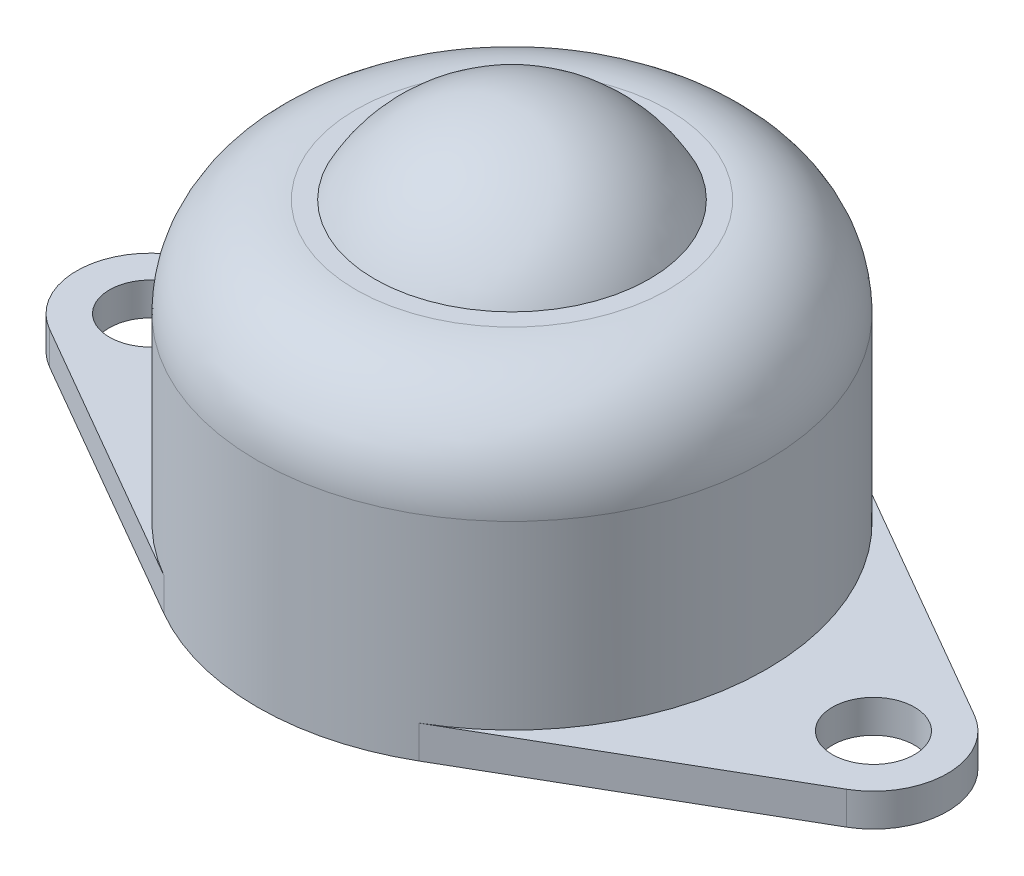
ISO-10303-21;
HEADER;
FILE_DESCRIPTION(('STEP AP214'),'2;1');
FILE_NAME('part.step','',(''),(''),'','','');
FILE_SCHEMA(('AUTOMOTIVE_DESIGN { 1 0 10303 214 1 1 1 1 }'));
ENDSEC;
DATA;
#1=APPLICATION_CONTEXT('core data for automotive mechanical design processes');
#2=APPLICATION_PROTOCOL_DEFINITION('international standard','automotive_design',2000,#1);
#3=PRODUCT_CONTEXT('',#1,'mechanical');
#4=PRODUCT('Part','Part','',(#3));
#5=PRODUCT_RELATED_PRODUCT_CATEGORY('part','',(#4));
#6=PRODUCT_DEFINITION_FORMATION('','',#4);
#7=PRODUCT_DEFINITION_CONTEXT('part definition',#1,'design');
#8=PRODUCT_DEFINITION('design','',#6,#7);
#9=PRODUCT_DEFINITION_SHAPE('','',#8);
#10=(LENGTH_UNIT() NAMED_UNIT(*) SI_UNIT(.MILLI.,.METRE.));
#11=(NAMED_UNIT(*) PLANE_ANGLE_UNIT() SI_UNIT($,.RADIAN.));
#12=(NAMED_UNIT(*) SI_UNIT($,.STERADIAN.) SOLID_ANGLE_UNIT());
#13=UNCERTAINTY_MEASURE_WITH_UNIT(LENGTH_MEASURE(1.E-05),#10,'distance_accuracy_value','');
#14=(GEOMETRIC_REPRESENTATION_CONTEXT(3) GLOBAL_UNCERTAINTY_ASSIGNED_CONTEXT((#13)) GLOBAL_UNIT_ASSIGNED_CONTEXT((#10,
#11,#12)) REPRESENTATION_CONTEXT('',''));
#15=CARTESIAN_POINT('',(0.,0.,0.));
#16=DIRECTION('',(0.,0.,1.));
#17=DIRECTION('',(1.,0.,0.));
#18=AXIS2_PLACEMENT_3D('',#15,#16,#17);
#19=CARTESIAN_POINT('',(0.,-1.5,0.));
#20=DIRECTION('',(0.,1.,0.));
#21=DIRECTION('',(0.,0.,1.));
#22=AXIS2_PLACEMENT_3D('',#19,#20,#21);
#23=TOROIDAL_SURFACE('',#22,9.5,6.);
#24=CARTESIAN_POINT('',(0.,4.5,0.));
#25=DIRECTION('',(0.,1.,0.));
#26=DIRECTION('',(0.,0.,1.));
#27=AXIS2_PLACEMENT_3D('',#24,#25,#26);
#28=CIRCLE('',#27,9.49999999999996);
#29=CARTESIAN_POINT('',(0.,4.5,9.49999999999996));
#30=VERTEX_POINT('',#29);
#31=EDGE_CURVE('E175',#30,#30,#28,.T.);
#32=ORIENTED_EDGE('',*,*,#31,.F.);
#33=EDGE_LOOP('',(#32));
#34=FACE_BOUND('',#33,.T.);
#35=CARTESIAN_POINT('',(0.,-1.50000000000004,0.));
#36=DIRECTION('',(0.,1.,0.));
#37=DIRECTION('',(0.,0.,1.));
#38=AXIS2_PLACEMENT_3D('',#35,#36,#37);
#39=CIRCLE('',#38,15.5);
#40=CARTESIAN_POINT('',(0.,-1.50000000000004,15.5));
#41=VERTEX_POINT('',#40);
#42=EDGE_CURVE('E155',#41,#41,#39,.T.);
#43=ORIENTED_EDGE('',*,*,#42,.T.);
#44=EDGE_LOOP('',(#43));
#45=FACE_BOUND('',#44,.T.);
#46=ADVANCED_FACE('F38',(#34,#45),#23,.T.);
#47=CARTESIAN_POINT('',(9.49999999999996,4.5,0.));
#48=DIRECTION('',(0.,-1.,0.));
#49=DIRECTION('',(0.,0.,-1.));
#50=AXIS2_PLACEMENT_3D('',#47,#48,#49);
#51=PLANE('',#50);
#52=CARTESIAN_POINT('',(0.,4.5,0.));
#53=DIRECTION('',(0.,1.,0.));
#54=DIRECTION('',(0.,0.,1.));
#55=AXIS2_PLACEMENT_3D('',#52,#53,#54);
#56=CIRCLE('',#55,8.36660026534075);
#57=CARTESIAN_POINT('',(0.,4.5,8.36660026534075));
#58=VERTEX_POINT('',#57);
#59=EDGE_CURVE('E172',#58,#58,#56,.T.);
#60=ORIENTED_EDGE('',*,*,#59,.F.);
#61=EDGE_LOOP('',(#60));
#62=FACE_BOUND('',#61,.T.);
#63=ORIENTED_EDGE('',*,*,#31,.T.);
#64=EDGE_LOOP('',(#63));
#65=FACE_BOUND('',#64,.T.);
#66=ADVANCED_FACE('F215',(#62,#65),#51,.F.);
#67=CARTESIAN_POINT('',(0.,0.,0.));
#68=DIRECTION('',(0.,1.,0.));
#69=DIRECTION('',(1.,0.,0.));
#70=AXIS2_PLACEMENT_3D('',#67,#68,#69);
#71=SPHERICAL_SURFACE('',#70,9.5);
#72=ORIENTED_EDGE('',*,*,#59,.T.);
#73=EDGE_LOOP('',(#72));
#74=FACE_BOUND('',#73,.T.);
#75=ADVANCED_FACE('F220',(#74),#71,.T.);
#76=CARTESIAN_POINT('',(0.,-14.5,0.));
#77=DIRECTION('',(0.,1.,0.));
#78=DIRECTION('',(0.,0.,1.));
#79=AXIS2_PLACEMENT_3D('',#76,#77,#78);
#80=PLANE('',#79);
#81=CARTESIAN_POINT('',(0.,-14.5,0.));
#82=DIRECTION('',(0.,1.,0.));
#83=DIRECTION('',(0.,0.,1.));
#84=AXIS2_PLACEMENT_3D('',#81,#82,#83);
#85=CIRCLE('',#84,15.5);
#86=CARTESIAN_POINT('',(7.75,-14.5,-13.4233937586588));
#87=VERTEX_POINT('',#86);
#88=CARTESIAN_POINT('',(-7.75,-14.5,-13.4233937586588));
#89=VERTEX_POINT('',#88);
#90=EDGE_CURVE('E171',#87,#89,#85,.T.);
#91=ORIENTED_EDGE('',*,*,#90,.F.);
#92=DIRECTION('',(0.866025403784439,0.,0.5));
#93=VECTOR('',#92,1.);
#94=CARTESIAN_POINT('',(24.25,-14.5,-3.89711431702997));
#95=LINE('',#94,#93);
#96=CARTESIAN_POINT('',(24.25,-14.5,-3.89711431702997));
#97=VERTEX_POINT('',#96);
#98=EDGE_CURVE('E124',#87,#97,#95,.T.);
#99=ORIENTED_EDGE('',*,*,#98,.T.);
#100=CARTESIAN_POINT('',(22.,-14.5,0.));
#101=DIRECTION('',(0.,-1.,0.));
#102=DIRECTION('',(0.,0.,1.));
#103=AXIS2_PLACEMENT_3D('',#100,#101,#102);
#104=CIRCLE('',#103,4.5);
#105=CARTESIAN_POINT('',(24.25,-14.5,3.89711431702997));
#106=VERTEX_POINT('',#105);
#107=EDGE_CURVE('E142',#97,#106,#104,.T.);
#108=ORIENTED_EDGE('',*,*,#107,.T.);
#109=DIRECTION('',(-0.866025403784439,0.,0.5));
#110=VECTOR('',#109,1.);
#111=CARTESIAN_POINT('',(24.25,-14.5,3.89711431702997));
#112=LINE('',#111,#110);
#113=CARTESIAN_POINT('',(7.75,-14.5,13.4233937586588));
#114=VERTEX_POINT('',#113);
#115=EDGE_CURVE('E106',#106,#114,#112,.T.);
#116=ORIENTED_EDGE('',*,*,#115,.T.);
#117=CARTESIAN_POINT('',(-7.75,-14.5,13.4233937586588));
#118=VERTEX_POINT('',#117);
#119=EDGE_CURVE('E169',#118,#114,#85,.T.);
#120=ORIENTED_EDGE('',*,*,#119,.F.);
#121=DIRECTION('',(-0.866025403784439,0.,-0.5));
#122=VECTOR('',#121,1.);
#123=CARTESIAN_POINT('',(-24.25,-14.5,3.89711431702997));
#124=LINE('',#123,#122);
#125=CARTESIAN_POINT('',(-24.25,-14.5,3.89711431702997));
#126=VERTEX_POINT('',#125);
#127=EDGE_CURVE('E146',#118,#126,#124,.T.);
#128=ORIENTED_EDGE('',*,*,#127,.T.);
#129=CARTESIAN_POINT('',(-22.,-14.5,0.));
#130=DIRECTION('',(0.,-1.,0.));
#131=DIRECTION('',(0.,0.,-1.));
#132=AXIS2_PLACEMENT_3D('',#129,#130,#131);
#133=CIRCLE('',#132,4.5);
#134=CARTESIAN_POINT('',(-24.25,-14.5,-3.89711431702997));
#135=VERTEX_POINT('',#134);
#136=EDGE_CURVE('E149',#126,#135,#133,.T.);
#137=ORIENTED_EDGE('',*,*,#136,.T.);
#138=DIRECTION('',(0.866025403784439,0.,-0.5));
#139=VECTOR('',#138,1.);
#140=CARTESIAN_POINT('',(-24.25,-14.5,-3.89711431702997));
#141=LINE('',#140,#139);
#142=EDGE_CURVE('E127',#135,#89,#141,.T.);
#143=ORIENTED_EDGE('',*,*,#142,.T.);
#144=EDGE_LOOP('',(#91,#99,#108,#116,#120,#128,#137,#143));
#145=FACE_BOUND('',#144,.T.);
#146=CARTESIAN_POINT('',(-22.,-14.5,0.));
#147=DIRECTION('',(0.,-1.,0.));
#148=DIRECTION('',(0.,0.,-1.));
#149=AXIS2_PLACEMENT_3D('',#146,#147,#148);
#150=CIRCLE('',#149,2.5);
#151=CARTESIAN_POINT('',(-22.,-14.5,-2.5));
#152=VERTEX_POINT('',#151);
#153=EDGE_CURVE('E130',#152,#152,#150,.T.);
#154=ORIENTED_EDGE('',*,*,#153,.F.);
#155=EDGE_LOOP('',(#154));
#156=FACE_BOUND('',#155,.T.);
#157=CARTESIAN_POINT('',(22.,-14.5,0.));
#158=DIRECTION('',(0.,-1.,0.));
#159=DIRECTION('',(0.,0.,1.));
#160=AXIS2_PLACEMENT_3D('',#157,#158,#159);
#161=CIRCLE('',#160,2.5);
#162=CARTESIAN_POINT('',(22.,-14.5,2.5));
#163=VERTEX_POINT('',#162);
#164=EDGE_CURVE('E333',#163,#163,#161,.T.);
#165=ORIENTED_EDGE('',*,*,#164,.F.);
#166=EDGE_LOOP('',(#165));
#167=FACE_BOUND('',#166,.T.);
#168=ADVANCED_FACE('F196',(#145,#156,#167),#80,.F.);
#169=CARTESIAN_POINT('',(0.,9.5,0.));
#170=DIRECTION('',(0.,1.,0.));
#171=DIRECTION('',(0.,0.,1.));
#172=AXIS2_PLACEMENT_3D('',#169,#170,#171);
#173=CYLINDRICAL_SURFACE('',#172,15.5);
#174=CARTESIAN_POINT('',(0.,-12.5,0.));
#175=DIRECTION('',(0.,1.,0.));
#176=DIRECTION('',(0.,0.,1.));
#177=AXIS2_PLACEMENT_3D('',#174,#175,#176);
#178=CIRCLE('',#177,15.5);
#179=CARTESIAN_POINT('',(-7.75,-12.5,-13.4233937586588));
#180=VERTEX_POINT('',#179);
#181=CARTESIAN_POINT('',(-7.75,-12.5,13.4233937586588));
#182=VERTEX_POINT('',#181);
#183=EDGE_CURVE('E45',#180,#182,#178,.T.);
#184=ORIENTED_EDGE('',*,*,#183,.T.);
#185=DIRECTION('',(0.,-1.,0.));
#186=VECTOR('',#185,1.);
#187=CARTESIAN_POINT('',(-7.75,-12.5,13.4233937586588));
#188=LINE('',#187,#186);
#189=EDGE_CURVE('E163',#182,#118,#188,.T.);
#190=ORIENTED_EDGE('',*,*,#189,.T.);
#191=ORIENTED_EDGE('',*,*,#119,.T.);
#192=DIRECTION('',(0.,-1.,0.));
#193=VECTOR('',#192,1.);
#194=CARTESIAN_POINT('',(7.75,-12.5,13.4233937586588));
#195=LINE('',#194,#193);
#196=CARTESIAN_POINT('',(7.75,-12.5,13.4233937586588));
#197=VERTEX_POINT('',#196);
#198=EDGE_CURVE('E111',#197,#114,#195,.T.);
#199=ORIENTED_EDGE('',*,*,#198,.F.);
#200=CARTESIAN_POINT('',(7.75,-12.5,-13.4233937586588));
#201=VERTEX_POINT('',#200);
#202=EDGE_CURVE('E11',#197,#201,#178,.T.);
#203=ORIENTED_EDGE('',*,*,#202,.T.);
#204=DIRECTION('',(0.,-1.,0.));
#205=VECTOR('',#204,1.);
#206=CARTESIAN_POINT('',(7.75,-12.5,-13.4233937586588));
#207=LINE('',#206,#205);
#208=EDGE_CURVE('E156',#201,#87,#207,.T.);
#209=ORIENTED_EDGE('',*,*,#208,.T.);
#210=ORIENTED_EDGE('',*,*,#90,.T.);
#211=DIRECTION('',(0.,-1.,0.));
#212=VECTOR('',#211,1.);
#213=CARTESIAN_POINT('',(-7.74999999999999,-12.5,-13.4233937586588));
#214=LINE('',#213,#212);
#215=EDGE_CURVE('E57',#180,#89,#214,.T.);
#216=ORIENTED_EDGE('',*,*,#215,.F.);
#217=EDGE_LOOP('',(#184,#190,#191,#199,#203,#209,#210,#216));
#218=FACE_BOUND('',#217,.T.);
#219=ORIENTED_EDGE('',*,*,#42,.F.);
#220=EDGE_LOOP('',(#219));
#221=FACE_BOUND('',#220,.T.);
#222=ADVANCED_FACE('F181',(#218,#221),#173,.T.);
#223=CARTESIAN_POINT('',(-22.,-12.5,0.));
#224=DIRECTION('',(0.,-1.,0.));
#225=DIRECTION('',(0.,0.,-1.));
#226=AXIS2_PLACEMENT_3D('',#223,#224,#225);
#227=CYLINDRICAL_SURFACE('',#226,4.5);
#228=ORIENTED_EDGE('',*,*,#136,.F.);
#229=DIRECTION('',(0.,-1.,0.));
#230=VECTOR('',#229,1.);
#231=CARTESIAN_POINT('',(-24.25,-12.5,3.89711431702997));
#232=LINE('',#231,#230);
#233=CARTESIAN_POINT('',(-24.25,-12.5,3.89711431702997));
#234=VERTEX_POINT('',#233);
#235=EDGE_CURVE('E161',#234,#126,#232,.T.);
#236=ORIENTED_EDGE('',*,*,#235,.F.);
#237=CARTESIAN_POINT('',(-22.,-12.5,0.));
#238=DIRECTION('',(0.,-1.,0.));
#239=DIRECTION('',(0.,0.,-1.));
#240=AXIS2_PLACEMENT_3D('',#237,#238,#239);
#241=CIRCLE('',#240,4.5);
#242=CARTESIAN_POINT('',(-24.25,-12.5,-3.89711431702997));
#243=VERTEX_POINT('',#242);
#244=EDGE_CURVE('E135',#234,#243,#241,.T.);
#245=ORIENTED_EDGE('',*,*,#244,.T.);
#246=DIRECTION('',(0.,-1.,0.));
#247=VECTOR('',#246,1.);
#248=CARTESIAN_POINT('',(-24.25,-12.5,-3.89711431702997));
#249=LINE('',#248,#247);
#250=EDGE_CURVE('E159',#243,#135,#249,.T.);
#251=ORIENTED_EDGE('',*,*,#250,.T.);
#252=EDGE_LOOP('',(#228,#236,#245,#251));
#253=FACE_BOUND('',#252,.T.);
#254=ADVANCED_FACE('F193',(#253),#227,.T.);
#255=CARTESIAN_POINT('',(-22.,-12.5,0.));
#256=DIRECTION('',(0.,-1.,0.));
#257=DIRECTION('',(0.,0.,-1.));
#258=AXIS2_PLACEMENT_3D('',#255,#256,#257);
#259=CYLINDRICAL_SURFACE('',#258,2.5);
#260=CARTESIAN_POINT('',(-22.,-12.5,0.));
#261=DIRECTION('',(0.,-1.,0.));
#262=DIRECTION('',(0.,0.,-1.));
#263=AXIS2_PLACEMENT_3D('',#260,#261,#262);
#264=CIRCLE('',#263,2.5);
#265=CARTESIAN_POINT('',(-22.,-12.5,-2.5));
#266=VERTEX_POINT('',#265);
#267=EDGE_CURVE('E144',#266,#266,#264,.T.);
#268=ORIENTED_EDGE('',*,*,#267,.F.);
#269=EDGE_LOOP('',(#268));
#270=FACE_BOUND('',#269,.T.);
#271=ORIENTED_EDGE('',*,*,#153,.T.);
#272=EDGE_LOOP('',(#271));
#273=FACE_BOUND('',#272,.T.);
#274=ADVANCED_FACE('F230',(#270,#273),#259,.F.);
#275=CARTESIAN_POINT('',(22.,-12.5,0.));
#276=DIRECTION('',(0.,1.,0.));
#277=DIRECTION('',(0.,0.,1.));
#278=AXIS2_PLACEMENT_3D('',#275,#276,#277);
#279=PLANE('',#278);
#280=ORIENTED_EDGE('',*,*,#267,.T.);
#281=EDGE_LOOP('',(#280));
#282=FACE_BOUND('',#281,.T.);
#283=ORIENTED_EDGE('',*,*,#183,.F.);
#284=DIRECTION('',(0.866025403784439,0.,-0.5));
#285=VECTOR('',#284,1.);
#286=CARTESIAN_POINT('',(-24.25,-12.5,-3.89711431702997));
#287=LINE('',#286,#285);
#288=EDGE_CURVE('E138',#243,#180,#287,.T.);
#289=ORIENTED_EDGE('',*,*,#288,.F.);
#290=ORIENTED_EDGE('',*,*,#244,.F.);
#291=DIRECTION('',(-0.866025403784439,0.,-0.5));
#292=VECTOR('',#291,1.);
#293=CARTESIAN_POINT('',(-24.25,-12.5,3.89711431702997));
#294=LINE('',#293,#292);
#295=EDGE_CURVE('E120',#182,#234,#294,.T.);
#296=ORIENTED_EDGE('',*,*,#295,.F.);
#297=EDGE_LOOP('',(#283,#289,#290,#296));
#298=FACE_BOUND('',#297,.T.);
#299=ADVANCED_FACE('F190',(#282,#298),#279,.T.);
#300=CARTESIAN_POINT('',(-24.25,-12.5,3.89711431702997));
#301=DIRECTION('',(-0.5,0.,0.866025403784439));
#302=DIRECTION('',(0.866025403784439,0.,0.5));
#303=AXIS2_PLACEMENT_3D('',#300,#301,#302);
#304=PLANE('',#303);
#305=ORIENTED_EDGE('',*,*,#127,.F.);
#306=ORIENTED_EDGE('',*,*,#189,.F.);
#307=ORIENTED_EDGE('',*,*,#295,.T.);
#308=ORIENTED_EDGE('',*,*,#235,.T.);
#309=EDGE_LOOP('',(#305,#306,#307,#308));
#310=FACE_BOUND('',#309,.T.);
#311=ADVANCED_FACE('F188',(#310),#304,.T.);
#312=CARTESIAN_POINT('',(-24.25,-12.5,-3.89711431702997));
#313=DIRECTION('',(-0.5,0.,-0.866025403784439));
#314=DIRECTION('',(-0.866025403784439,0.,0.5));
#315=AXIS2_PLACEMENT_3D('',#312,#313,#314);
#316=PLANE('',#315);
#317=ORIENTED_EDGE('',*,*,#142,.F.);
#318=ORIENTED_EDGE('',*,*,#250,.F.);
#319=ORIENTED_EDGE('',*,*,#288,.T.);
#320=ORIENTED_EDGE('',*,*,#215,.T.);
#321=EDGE_LOOP('',(#317,#318,#319,#320));
#322=FACE_BOUND('',#321,.T.);
#323=ADVANCED_FACE('F202',(#322),#316,.T.);
#324=CARTESIAN_POINT('',(22.,-12.5,0.));
#325=DIRECTION('',(0.,-1.,0.));
#326=DIRECTION('',(0.,0.,1.));
#327=AXIS2_PLACEMENT_3D('',#324,#325,#326);
#328=CIRCLE('',#327,2.5);
#329=CARTESIAN_POINT('',(22.,-12.5,2.5));
#330=VERTEX_POINT('',#329);
#331=EDGE_CURVE('E330',#330,#330,#328,.T.);
#332=ORIENTED_EDGE('',*,*,#331,.T.);
#333=EDGE_LOOP('',(#332));
#334=FACE_BOUND('',#333,.T.);
#335=ORIENTED_EDGE('',*,*,#202,.F.);
#336=DIRECTION('',(-0.866025403784439,0.,0.5));
#337=VECTOR('',#336,1.);
#338=CARTESIAN_POINT('',(24.25,-12.5,3.89711431702997));
#339=LINE('',#338,#337);
#340=CARTESIAN_POINT('',(24.25,-12.5,3.89711431702997));
#341=VERTEX_POINT('',#340);
#342=EDGE_CURVE('E104',#341,#197,#339,.T.);
#343=ORIENTED_EDGE('',*,*,#342,.F.);
#344=CARTESIAN_POINT('',(22.,-12.5,0.));
#345=DIRECTION('',(0.,-1.,0.));
#346=DIRECTION('',(0.,0.,1.));
#347=AXIS2_PLACEMENT_3D('',#344,#345,#346);
#348=CIRCLE('',#347,4.5);
#349=CARTESIAN_POINT('',(24.25,-12.5,-3.89711431702997));
#350=VERTEX_POINT('',#349);
#351=EDGE_CURVE('E118',#350,#341,#348,.T.);
#352=ORIENTED_EDGE('',*,*,#351,.F.);
#353=DIRECTION('',(0.866025403784439,0.,0.5));
#354=VECTOR('',#353,1.);
#355=CARTESIAN_POINT('',(24.25,-12.5,-3.89711431702997));
#356=LINE('',#355,#354);
#357=EDGE_CURVE('E112',#201,#350,#356,.T.);
#358=ORIENTED_EDGE('',*,*,#357,.F.);
#359=EDGE_LOOP('',(#335,#343,#352,#358));
#360=FACE_BOUND('',#359,.T.);
#361=ADVANCED_FACE('F116',(#334,#360),#279,.T.);
#362=CARTESIAN_POINT('',(22.,-12.5,0.));
#363=DIRECTION('',(0.,-1.,0.));
#364=DIRECTION('',(0.,0.,-1.));
#365=AXIS2_PLACEMENT_3D('',#362,#363,#364);
#366=CYLINDRICAL_SURFACE('',#365,4.5);
#367=ORIENTED_EDGE('',*,*,#107,.F.);
#368=DIRECTION('',(0.,-1.,0.));
#369=VECTOR('',#368,1.);
#370=CARTESIAN_POINT('',(24.25,-12.5,-3.89711431702997));
#371=LINE('',#370,#369);
#372=EDGE_CURVE('E123',#350,#97,#371,.T.);
#373=ORIENTED_EDGE('',*,*,#372,.F.);
#374=ORIENTED_EDGE('',*,*,#351,.T.);
#375=DIRECTION('',(0.,-1.,0.));
#376=VECTOR('',#375,1.);
#377=CARTESIAN_POINT('',(24.25,-12.5,3.89711431702997));
#378=LINE('',#377,#376);
#379=EDGE_CURVE('E100',#341,#106,#378,.T.);
#380=ORIENTED_EDGE('',*,*,#379,.T.);
#381=EDGE_LOOP('',(#367,#373,#374,#380));
#382=FACE_BOUND('',#381,.T.);
#383=ADVANCED_FACE('F122',(#382),#366,.T.);
#384=CARTESIAN_POINT('',(24.25,-12.5,-3.89711431702997));
#385=DIRECTION('',(0.5,0.,-0.866025403784439));
#386=DIRECTION('',(-0.866025403784439,0.,-0.5));
#387=AXIS2_PLACEMENT_3D('',#384,#385,#386);
#388=PLANE('',#387);
#389=ORIENTED_EDGE('',*,*,#98,.F.);
#390=ORIENTED_EDGE('',*,*,#208,.F.);
#391=ORIENTED_EDGE('',*,*,#357,.T.);
#392=ORIENTED_EDGE('',*,*,#372,.T.);
#393=EDGE_LOOP('',(#389,#390,#391,#392));
#394=FACE_BOUND('',#393,.T.);
#395=ADVANCED_FACE('F200',(#394),#388,.T.);
#396=CARTESIAN_POINT('',(24.25,-12.5,3.89711431702997));
#397=DIRECTION('',(0.5,0.,0.866025403784439));
#398=DIRECTION('',(0.866025403784439,0.,-0.5));
#399=AXIS2_PLACEMENT_3D('',#396,#397,#398);
#400=PLANE('',#399);
#401=ORIENTED_EDGE('',*,*,#115,.F.);
#402=ORIENTED_EDGE('',*,*,#379,.F.);
#403=ORIENTED_EDGE('',*,*,#342,.T.);
#404=ORIENTED_EDGE('',*,*,#198,.T.);
#405=EDGE_LOOP('',(#401,#402,#403,#404));
#406=FACE_BOUND('',#405,.T.);
#407=ADVANCED_FACE('F102',(#406),#400,.T.);
#408=CARTESIAN_POINT('',(22.,-12.5,0.));
#409=DIRECTION('',(0.,-1.,0.));
#410=DIRECTION('',(0.,0.,-1.));
#411=AXIS2_PLACEMENT_3D('',#408,#409,#410);
#412=CYLINDRICAL_SURFACE('',#411,2.5);
#413=ORIENTED_EDGE('',*,*,#331,.F.);
#414=EDGE_LOOP('',(#413));
#415=FACE_BOUND('',#414,.T.);
#416=ORIENTED_EDGE('',*,*,#164,.T.);
#417=EDGE_LOOP('',(#416));
#418=FACE_BOUND('',#417,.T.);
#419=ADVANCED_FACE('F315',(#415,#418),#412,.F.);
#420=CLOSED_SHELL('',(#46,#66,#75,#168,#222,#254,#274,#299,#311,#323,#361,#383,#395,#407,#419));
#421=MANIFOLD_SOLID_BREP('B2',#420);
#422=ADVANCED_BREP_SHAPE_REPRESENTATION('',(#18,#421),#14);
#423=SHAPE_DEFINITION_REPRESENTATION(#9,#422);
ENDSEC;
END-ISO-10303-21;
